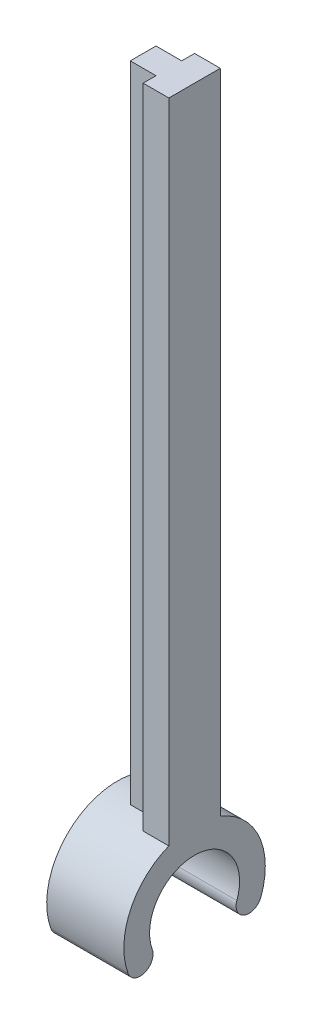
ISO-10303-21;
HEADER;
FILE_DESCRIPTION(('STEP AP214'),'2;1');
FILE_NAME('part.step','',(''),(''),'','','');
FILE_SCHEMA(('AUTOMOTIVE_DESIGN { 1 0 10303 214 1 1 1 1 }'));
ENDSEC;
DATA;
#1=APPLICATION_CONTEXT('core data for automotive mechanical design processes');
#2=APPLICATION_PROTOCOL_DEFINITION('international standard','automotive_design',2000,#1);
#3=PRODUCT_CONTEXT('',#1,'mechanical');
#4=PRODUCT('Part','Part','',(#3));
#5=PRODUCT_RELATED_PRODUCT_CATEGORY('part','',(#4));
#6=PRODUCT_DEFINITION_FORMATION('','',#4);
#7=PRODUCT_DEFINITION_CONTEXT('part definition',#1,'design');
#8=PRODUCT_DEFINITION('design','',#6,#7);
#9=PRODUCT_DEFINITION_SHAPE('','',#8);
#10=(LENGTH_UNIT() NAMED_UNIT(*) SI_UNIT(.MILLI.,.METRE.));
#11=(NAMED_UNIT(*) PLANE_ANGLE_UNIT() SI_UNIT($,.RADIAN.));
#12=(NAMED_UNIT(*) SI_UNIT($,.STERADIAN.) SOLID_ANGLE_UNIT());
#13=UNCERTAINTY_MEASURE_WITH_UNIT(LENGTH_MEASURE(1.E-05),#10,'distance_accuracy_value','');
#14=(GEOMETRIC_REPRESENTATION_CONTEXT(3) GLOBAL_UNCERTAINTY_ASSIGNED_CONTEXT((#13)) GLOBAL_UNIT_ASSIGNED_CONTEXT((#10,
#11,#12)) REPRESENTATION_CONTEXT('',''));
#15=CARTESIAN_POINT('',(0.,0.,0.));
#16=DIRECTION('',(0.,0.,1.));
#17=DIRECTION('',(1.,0.,0.));
#18=AXIS2_PLACEMENT_3D('',#15,#16,#17);
#19=CARTESIAN_POINT('',(2.,0.,0.));
#20=DIRECTION('',(-1.,0.,0.));
#21=DIRECTION('',(0.,0.,1.));
#22=AXIS2_PLACEMENT_3D('',#19,#20,#21);
#23=CYLINDRICAL_SURFACE('',#22,5.5);
#24=DIRECTION('',(-1.,0.,0.));
#25=VECTOR('',#24,1.);
#26=CARTESIAN_POINT('',(2.,5.40832691319598,-1.00000000000001));
#27=LINE('',#26,#25);
#28=CARTESIAN_POINT('',(0.,5.40832691319598,-1.00000000000001));
#29=VERTEX_POINT('',#28);
#30=CARTESIAN_POINT('',(-2.,5.40832691319598,-1.00000000000001));
#31=VERTEX_POINT('',#30);
#32=EDGE_CURVE('E155',#29,#31,#27,.T.);
#33=ORIENTED_EDGE('',*,*,#32,.F.);
#34=CARTESIAN_POINT('',(0.,0.,0.));
#35=DIRECTION('',(1.,0.,0.));
#36=DIRECTION('',(0.,0.,-1.));
#37=AXIS2_PLACEMENT_3D('',#34,#35,#36);
#38=CIRCLE('',#37,5.5);
#39=CARTESIAN_POINT('',(0.,5.1234753829798,-2.));
#40=VERTEX_POINT('',#39);
#41=EDGE_CURVE('E11',#40,#29,#38,.T.);
#42=ORIENTED_EDGE('',*,*,#41,.F.);
#43=DIRECTION('',(-1.,0.,0.));
#44=VECTOR('',#43,1.);
#45=CARTESIAN_POINT('',(2.,5.1234753829798,-2.));
#46=LINE('',#45,#44);
#47=CARTESIAN_POINT('',(2.,5.1234753829798,-2.));
#48=VERTEX_POINT('',#47);
#49=EDGE_CURVE('E206',#48,#40,#46,.T.);
#50=ORIENTED_EDGE('',*,*,#49,.F.);
#51=CARTESIAN_POINT('',(2.,0.,0.));
#52=DIRECTION('',(1.,0.,0.));
#53=DIRECTION('',(0.,0.,-1.));
#54=AXIS2_PLACEMENT_3D('',#51,#52,#53);
#55=CIRCLE('',#54,5.5);
#56=CARTESIAN_POINT('',(2.,-1.88111078829118,-5.16830941432249));
#57=VERTEX_POINT('',#56);
#58=EDGE_CURVE('E234',#57,#48,#55,.T.);
#59=ORIENTED_EDGE('',*,*,#58,.F.);
#60=DIRECTION('',(-1.,0.,0.));
#61=VECTOR('',#60,1.);
#62=CARTESIAN_POINT('',(2.,-1.88111078829118,-5.16830941432249));
#63=LINE('',#62,#61);
#64=CARTESIAN_POINT('',(-4.,-1.88111078829118,-5.16830941432249));
#65=VERTEX_POINT('',#64);
#66=EDGE_CURVE('E248',#57,#65,#63,.T.);
#67=ORIENTED_EDGE('',*,*,#66,.T.);
#68=CARTESIAN_POINT('',(-4.,0.,0.));
#69=DIRECTION('',(1.,0.,0.));
#70=DIRECTION('',(0.,0.,-1.));
#71=AXIS2_PLACEMENT_3D('',#68,#69,#70);
#72=CIRCLE('',#71,5.5);
#73=CARTESIAN_POINT('',(-4.,-1.88111078829118,5.16830941432249));
#74=VERTEX_POINT('',#73);
#75=EDGE_CURVE('E218',#65,#74,#72,.T.);
#76=ORIENTED_EDGE('',*,*,#75,.T.);
#77=DIRECTION('',(-1.,0.,0.));
#78=VECTOR('',#77,1.);
#79=CARTESIAN_POINT('',(2.,-1.88111078829118,5.16830941432249));
#80=LINE('',#79,#78);
#81=CARTESIAN_POINT('',(2.,-1.88111078829118,5.16830941432249));
#82=VERTEX_POINT('',#81);
#83=EDGE_CURVE('E245',#82,#74,#80,.T.);
#84=ORIENTED_EDGE('',*,*,#83,.F.);
#85=CARTESIAN_POINT('',(2.,5.1234753829798,2.));
#86=VERTEX_POINT('',#85);
#87=EDGE_CURVE('E233',#86,#82,#55,.T.);
#88=ORIENTED_EDGE('',*,*,#87,.F.);
#89=DIRECTION('',(-1.,0.,0.));
#90=VECTOR('',#89,1.);
#91=CARTESIAN_POINT('',(2.,5.1234753829798,2.));
#92=LINE('',#91,#90);
#93=CARTESIAN_POINT('',(0.,5.1234753829798,2.));
#94=VERTEX_POINT('',#93);
#95=EDGE_CURVE('E202',#86,#94,#92,.T.);
#96=ORIENTED_EDGE('',*,*,#95,.T.);
#97=CARTESIAN_POINT('',(0.,5.40832691319598,0.999999999999994));
#98=VERTEX_POINT('',#97);
#99=EDGE_CURVE('E50',#98,#94,#38,.T.);
#100=ORIENTED_EDGE('',*,*,#99,.F.);
#101=DIRECTION('',(-1.,0.,0.));
#102=VECTOR('',#101,1.);
#103=CARTESIAN_POINT('',(2.,5.40832691319598,0.999999999999994));
#104=LINE('',#103,#102);
#105=CARTESIAN_POINT('',(-2.,5.40832691319598,0.999999999999994));
#106=VERTEX_POINT('',#105);
#107=EDGE_CURVE('E57',#98,#106,#104,.T.);
#108=ORIENTED_EDGE('',*,*,#107,.T.);
#109=CARTESIAN_POINT('',(-2.,0.,0.));
#110=DIRECTION('',(1.,0.,0.));
#111=DIRECTION('',(0.,0.,-1.));
#112=AXIS2_PLACEMENT_3D('',#109,#110,#111);
#113=CIRCLE('',#112,5.5);
#114=EDGE_CURVE('E61',#31,#106,#113,.T.);
#115=ORIENTED_EDGE('',*,*,#114,.F.);
#116=EDGE_LOOP('',(#33,#42,#50,#59,#67,#76,#84,#88,#96,#100,#108,#115));
#117=FACE_BOUND('',#116,.T.);
#118=ADVANCED_FACE('F41',(#117),#23,.T.);
#119=CARTESIAN_POINT('',(0.,0.,0.));
#120=DIRECTION('',(1.,0.,0.));
#121=DIRECTION('',(0.,0.,-1.));
#122=AXIS2_PLACEMENT_3D('',#119,#120,#121);
#123=PLANE('',#122);
#124=DIRECTION('',(0.,-1.,0.));
#125=VECTOR('',#124,1.);
#126=CARTESIAN_POINT('',(0.,0.,-1.00000000000001));
#127=LINE('',#126,#125);
#128=CARTESIAN_POINT('',(0.,55.5,-1.));
#129=VERTEX_POINT('',#128);
#130=EDGE_CURVE('E160',#129,#29,#127,.T.);
#131=ORIENTED_EDGE('',*,*,#130,.F.);
#132=DIRECTION('',(0.,0.,-1.));
#133=VECTOR('',#132,1.);
#134=CARTESIAN_POINT('',(0.,55.5,0.));
#135=LINE('',#134,#133);
#136=CARTESIAN_POINT('',(0.,55.5,-2.));
#137=VERTEX_POINT('',#136);
#138=EDGE_CURVE('E147',#129,#137,#135,.T.);
#139=ORIENTED_EDGE('',*,*,#138,.T.);
#140=DIRECTION('',(0.,1.,0.));
#141=VECTOR('',#140,1.);
#142=CARTESIAN_POINT('',(0.,0.,-2.));
#143=LINE('',#142,#141);
#144=EDGE_CURVE('E175',#40,#137,#143,.T.);
#145=ORIENTED_EDGE('',*,*,#144,.F.);
#146=ORIENTED_EDGE('',*,*,#41,.T.);
#147=EDGE_LOOP('',(#131,#139,#145,#146));
#148=FACE_BOUND('',#147,.T.);
#149=ADVANCED_FACE('F277',(#148),#123,.F.);
#150=CARTESIAN_POINT('',(2.,0.,0.));
#151=DIRECTION('',(-1.,0.,0.));
#152=DIRECTION('',(0.,0.,1.));
#153=AXIS2_PLACEMENT_3D('',#150,#151,#152);
#154=CYLINDRICAL_SURFACE('',#153,3.5);
#155=DIRECTION('',(-1.,0.,0.));
#156=VECTOR('',#155,1.);
#157=CARTESIAN_POINT('',(2.,-1.19707050163984,3.28892417275068));
#158=LINE('',#157,#156);
#159=CARTESIAN_POINT('',(2.,-1.19707050163984,3.28892417275068));
#160=VERTEX_POINT('',#159);
#161=CARTESIAN_POINT('',(-4.,-1.19707050163984,3.28892417275068));
#162=VERTEX_POINT('',#161);
#163=EDGE_CURVE('E242',#160,#162,#158,.T.);
#164=ORIENTED_EDGE('',*,*,#163,.T.);
#165=CARTESIAN_POINT('',(-4.,0.,0.));
#166=DIRECTION('',(1.,0.,0.));
#167=DIRECTION('',(0.,0.,-1.));
#168=AXIS2_PLACEMENT_3D('',#165,#166,#167);
#169=CIRCLE('',#168,3.5);
#170=CARTESIAN_POINT('',(-4.,-1.19707050163984,-3.28892417275068));
#171=VERTEX_POINT('',#170);
#172=EDGE_CURVE('E210',#171,#162,#169,.T.);
#173=ORIENTED_EDGE('',*,*,#172,.F.);
#174=DIRECTION('',(-1.,0.,0.));
#175=VECTOR('',#174,1.);
#176=CARTESIAN_POINT('',(2.,-1.19707050163984,-3.28892417275068));
#177=LINE('',#176,#175);
#178=CARTESIAN_POINT('',(2.,-1.19707050163984,-3.28892417275068));
#179=VERTEX_POINT('',#178);
#180=EDGE_CURVE('E250',#179,#171,#177,.T.);
#181=ORIENTED_EDGE('',*,*,#180,.F.);
#182=CARTESIAN_POINT('',(2.,0.,0.));
#183=DIRECTION('',(1.,0.,0.));
#184=DIRECTION('',(0.,0.,-1.));
#185=AXIS2_PLACEMENT_3D('',#182,#183,#184);
#186=CIRCLE('',#185,3.5);
#187=EDGE_CURVE('E226',#179,#160,#186,.T.);
#188=ORIENTED_EDGE('',*,*,#187,.T.);
#189=EDGE_LOOP('',(#164,#173,#181,#188));
#190=FACE_BOUND('',#189,.T.);
#191=ADVANCED_FACE('F43',(#190),#154,.F.);
#192=CARTESIAN_POINT('',(2.,-1.53909064496551,-4.22861679353659));
#193=DIRECTION('',(-1.,0.,0.));
#194=DIRECTION('',(0.,0.,1.));
#195=AXIS2_PLACEMENT_3D('',#192,#193,#194);
#196=CYLINDRICAL_SURFACE('',#195,1.);
#197=ORIENTED_EDGE('',*,*,#180,.T.);
#198=CARTESIAN_POINT('',(-4.,-1.53909064496551,-4.22861679353659));
#199=DIRECTION('',(1.,0.,0.));
#200=DIRECTION('',(0.,0.,-1.));
#201=AXIS2_PLACEMENT_3D('',#198,#199,#200);
#202=CIRCLE('',#201,1.);
#203=EDGE_CURVE('E214',#65,#171,#202,.F.);
#204=ORIENTED_EDGE('',*,*,#203,.F.);
#205=ORIENTED_EDGE('',*,*,#66,.F.);
#206=CARTESIAN_POINT('',(2.,-1.53909064496551,-4.22861679353659));
#207=DIRECTION('',(1.,0.,0.));
#208=DIRECTION('',(0.,0.,-1.));
#209=AXIS2_PLACEMENT_3D('',#206,#207,#208);
#210=CIRCLE('',#209,1.);
#211=EDGE_CURVE('E229',#57,#179,#210,.F.);
#212=ORIENTED_EDGE('',*,*,#211,.T.);
#213=EDGE_LOOP('',(#197,#204,#205,#212));
#214=FACE_BOUND('',#213,.T.);
#215=ADVANCED_FACE('F287',(#214),#196,.T.);
#216=CARTESIAN_POINT('',(2.,-1.53909064496551,4.22861679353659));
#217=DIRECTION('',(-1.,0.,0.));
#218=DIRECTION('',(0.,0.,1.));
#219=AXIS2_PLACEMENT_3D('',#216,#217,#218);
#220=CYLINDRICAL_SURFACE('',#219,1.);
#221=ORIENTED_EDGE('',*,*,#83,.T.);
#222=CARTESIAN_POINT('',(-4.,-1.53909064496551,4.22861679353659));
#223=DIRECTION('',(1.,0.,0.));
#224=DIRECTION('',(0.,0.,-1.));
#225=AXIS2_PLACEMENT_3D('',#222,#223,#224);
#226=CIRCLE('',#225,1.);
#227=EDGE_CURVE('E222',#74,#162,#226,.T.);
#228=ORIENTED_EDGE('',*,*,#227,.T.);
#229=ORIENTED_EDGE('',*,*,#163,.F.);
#230=CARTESIAN_POINT('',(2.,-1.53909064496551,4.22861679353659));
#231=DIRECTION('',(1.,0.,0.));
#232=DIRECTION('',(0.,0.,-1.));
#233=AXIS2_PLACEMENT_3D('',#230,#231,#232);
#234=CIRCLE('',#233,1.);
#235=EDGE_CURVE('E238',#82,#160,#234,.T.);
#236=ORIENTED_EDGE('',*,*,#235,.F.);
#237=EDGE_LOOP('',(#221,#228,#229,#236));
#238=FACE_BOUND('',#237,.T.);
#239=ADVANCED_FACE('F285',(#238),#220,.T.);
#240=CARTESIAN_POINT('',(2.,0.,0.));
#241=DIRECTION('',(1.,0.,0.));
#242=DIRECTION('',(0.,0.,-1.));
#243=AXIS2_PLACEMENT_3D('',#240,#241,#242);
#244=PLANE('',#243);
#245=ORIENTED_EDGE('',*,*,#235,.T.);
#246=ORIENTED_EDGE('',*,*,#187,.F.);
#247=ORIENTED_EDGE('',*,*,#211,.F.);
#248=ORIENTED_EDGE('',*,*,#58,.T.);
#249=DIRECTION('',(0.,1.,0.));
#250=VECTOR('',#249,1.);
#251=CARTESIAN_POINT('',(2.,0.,-2.));
#252=LINE('',#251,#250);
#253=CARTESIAN_POINT('',(2.,55.5,-2.));
#254=VERTEX_POINT('',#253);
#255=EDGE_CURVE('E176',#48,#254,#252,.T.);
#256=ORIENTED_EDGE('',*,*,#255,.T.);
#257=DIRECTION('',(0.,0.,-1.));
#258=VECTOR('',#257,1.);
#259=CARTESIAN_POINT('',(2.,55.5,0.));
#260=LINE('',#259,#258);
#261=CARTESIAN_POINT('',(2.,55.5,2.));
#262=VERTEX_POINT('',#261);
#263=EDGE_CURVE('E179',#262,#254,#260,.T.);
#264=ORIENTED_EDGE('',*,*,#263,.F.);
#265=DIRECTION('',(0.,1.,0.));
#266=VECTOR('',#265,1.);
#267=CARTESIAN_POINT('',(2.,0.,2.));
#268=LINE('',#267,#266);
#269=EDGE_CURVE('E184',#86,#262,#268,.T.);
#270=ORIENTED_EDGE('',*,*,#269,.F.);
#271=ORIENTED_EDGE('',*,*,#87,.T.);
#272=EDGE_LOOP('',(#245,#246,#247,#248,#256,#264,#270,#271));
#273=FACE_BOUND('',#272,.T.);
#274=ADVANCED_FACE('F293',(#273),#244,.T.);
#275=CARTESIAN_POINT('',(-4.,0.,0.));
#276=DIRECTION('',(1.,0.,0.));
#277=DIRECTION('',(0.,0.,-1.));
#278=AXIS2_PLACEMENT_3D('',#275,#276,#277);
#279=PLANE('',#278);
#280=ORIENTED_EDGE('',*,*,#172,.T.);
#281=ORIENTED_EDGE('',*,*,#227,.F.);
#282=ORIENTED_EDGE('',*,*,#75,.F.);
#283=ORIENTED_EDGE('',*,*,#203,.T.);
#284=EDGE_LOOP('',(#280,#281,#282,#283));
#285=FACE_BOUND('',#284,.T.);
#286=ADVANCED_FACE('F304',(#285),#279,.F.);
#287=CARTESIAN_POINT('',(2.,0.,-2.));
#288=DIRECTION('',(0.,0.,1.));
#289=DIRECTION('',(1.,0.,0.));
#290=AXIS2_PLACEMENT_3D('',#287,#288,#289);
#291=PLANE('',#290);
#292=ORIENTED_EDGE('',*,*,#255,.F.);
#293=ORIENTED_EDGE('',*,*,#49,.T.);
#294=ORIENTED_EDGE('',*,*,#144,.T.);
#295=DIRECTION('',(-1.,0.,0.));
#296=VECTOR('',#295,1.);
#297=CARTESIAN_POINT('',(2.,55.5,-2.));
#298=LINE('',#297,#296);
#299=EDGE_CURVE('E199',#254,#137,#298,.T.);
#300=ORIENTED_EDGE('',*,*,#299,.F.);
#301=EDGE_LOOP('',(#292,#293,#294,#300));
#302=FACE_BOUND('',#301,.T.);
#303=ADVANCED_FACE('F315',(#302),#291,.F.);
#304=CARTESIAN_POINT('',(2.,0.,2.));
#305=DIRECTION('',(0.,0.,1.));
#306=DIRECTION('',(0.,-1.,0.));
#307=AXIS2_PLACEMENT_3D('',#304,#305,#306);
#308=PLANE('',#307);
#309=ORIENTED_EDGE('',*,*,#95,.F.);
#310=ORIENTED_EDGE('',*,*,#269,.T.);
#311=DIRECTION('',(-1.,0.,0.));
#312=VECTOR('',#311,1.);
#313=CARTESIAN_POINT('',(2.,55.5,2.));
#314=LINE('',#313,#312);
#315=CARTESIAN_POINT('',(0.,55.5,2.));
#316=VERTEX_POINT('',#315);
#317=EDGE_CURVE('E187',#262,#316,#314,.T.);
#318=ORIENTED_EDGE('',*,*,#317,.T.);
#319=DIRECTION('',(0.,1.,0.));
#320=VECTOR('',#319,1.);
#321=CARTESIAN_POINT('',(0.,0.,2.));
#322=LINE('',#321,#320);
#323=EDGE_CURVE('E180',#94,#316,#322,.T.);
#324=ORIENTED_EDGE('',*,*,#323,.F.);
#325=EDGE_LOOP('',(#309,#310,#318,#324));
#326=FACE_BOUND('',#325,.T.);
#327=ADVANCED_FACE('F263',(#326),#308,.T.);
#328=CARTESIAN_POINT('',(2.,55.5,0.));
#329=DIRECTION('',(0.,1.,0.));
#330=DIRECTION('',(0.,0.,1.));
#331=AXIS2_PLACEMENT_3D('',#328,#329,#330);
#332=PLANE('',#331);
#333=CARTESIAN_POINT('',(0.,55.5,1.));
#334=VERTEX_POINT('',#333);
#335=EDGE_CURVE('E191',#316,#334,#135,.T.);
#336=ORIENTED_EDGE('',*,*,#335,.F.);
#337=ORIENTED_EDGE('',*,*,#317,.F.);
#338=ORIENTED_EDGE('',*,*,#263,.T.);
#339=ORIENTED_EDGE('',*,*,#299,.T.);
#340=ORIENTED_EDGE('',*,*,#138,.F.);
#341=DIRECTION('',(1.,0.,0.));
#342=VECTOR('',#341,1.);
#343=CARTESIAN_POINT('',(-2.,55.5,-1.));
#344=LINE('',#343,#342);
#345=CARTESIAN_POINT('',(-2.,55.5,-1.));
#346=VERTEX_POINT('',#345);
#347=EDGE_CURVE('E143',#346,#129,#344,.T.);
#348=ORIENTED_EDGE('',*,*,#347,.F.);
#349=DIRECTION('',(0.,0.,-1.));
#350=VECTOR('',#349,1.);
#351=CARTESIAN_POINT('',(-2.,55.5,0.));
#352=LINE('',#351,#350);
#353=CARTESIAN_POINT('',(-2.,55.5,1.));
#354=VERTEX_POINT('',#353);
#355=EDGE_CURVE('E131',#354,#346,#352,.T.);
#356=ORIENTED_EDGE('',*,*,#355,.F.);
#357=DIRECTION('',(1.,0.,0.));
#358=VECTOR('',#357,1.);
#359=CARTESIAN_POINT('',(-2.,55.5,1.));
#360=LINE('',#359,#358);
#361=EDGE_CURVE('E152',#354,#334,#360,.T.);
#362=ORIENTED_EDGE('',*,*,#361,.T.);
#363=EDGE_LOOP('',(#336,#337,#338,#339,#340,#348,#356,#362));
#364=FACE_BOUND('',#363,.T.);
#365=ADVANCED_FACE('F145',(#364),#332,.T.);
#366=ORIENTED_EDGE('',*,*,#335,.T.);
#367=DIRECTION('',(0.,-1.,0.));
#368=VECTOR('',#367,1.);
#369=CARTESIAN_POINT('',(0.,0.,0.999999999999993));
#370=LINE('',#369,#368);
#371=EDGE_CURVE('E157',#334,#98,#370,.T.);
#372=ORIENTED_EDGE('',*,*,#371,.T.);
#373=ORIENTED_EDGE('',*,*,#99,.T.);
#374=ORIENTED_EDGE('',*,*,#323,.T.);
#375=EDGE_LOOP('',(#366,#372,#373,#374));
#376=FACE_BOUND('',#375,.T.);
#377=ADVANCED_FACE('F256',(#376),#123,.F.);
#378=CARTESIAN_POINT('',(-2.,0.,-1.00000000000001));
#379=DIRECTION('',(0.,0.,1.));
#380=DIRECTION('',(0.,-1.,0.));
#381=AXIS2_PLACEMENT_3D('',#378,#379,#380);
#382=PLANE('',#381);
#383=ORIENTED_EDGE('',*,*,#130,.T.);
#384=ORIENTED_EDGE('',*,*,#32,.T.);
#385=DIRECTION('',(0.,-1.,0.));
#386=VECTOR('',#385,1.);
#387=CARTESIAN_POINT('',(-2.,0.,-1.00000000000001));
#388=LINE('',#387,#386);
#389=EDGE_CURVE('E135',#346,#31,#388,.T.);
#390=ORIENTED_EDGE('',*,*,#389,.F.);
#391=ORIENTED_EDGE('',*,*,#347,.T.);
#392=EDGE_LOOP('',(#383,#384,#390,#391));
#393=FACE_BOUND('',#392,.T.);
#394=ADVANCED_FACE('F154',(#393),#382,.F.);
#395=CARTESIAN_POINT('',(-2.,0.,0.999999999999993));
#396=DIRECTION('',(0.,0.,1.));
#397=DIRECTION('',(0.,-1.,0.));
#398=AXIS2_PLACEMENT_3D('',#395,#396,#397);
#399=PLANE('',#398);
#400=ORIENTED_EDGE('',*,*,#107,.F.);
#401=ORIENTED_EDGE('',*,*,#371,.F.);
#402=ORIENTED_EDGE('',*,*,#361,.F.);
#403=DIRECTION('',(0.,-1.,0.));
#404=VECTOR('',#403,1.);
#405=CARTESIAN_POINT('',(-2.,0.,0.999999999999993));
#406=LINE('',#405,#404);
#407=EDGE_CURVE('E137',#354,#106,#406,.T.);
#408=ORIENTED_EDGE('',*,*,#407,.T.);
#409=EDGE_LOOP('',(#400,#401,#402,#408));
#410=FACE_BOUND('',#409,.T.);
#411=ADVANCED_FACE('F267',(#410),#399,.T.);
#412=CARTESIAN_POINT('',(-2.,0.,0.));
#413=DIRECTION('',(1.,0.,0.));
#414=DIRECTION('',(0.,0.,-1.));
#415=AXIS2_PLACEMENT_3D('',#412,#413,#414);
#416=PLANE('',#415);
#417=ORIENTED_EDGE('',*,*,#389,.T.);
#418=ORIENTED_EDGE('',*,*,#114,.T.);
#419=ORIENTED_EDGE('',*,*,#407,.F.);
#420=ORIENTED_EDGE('',*,*,#355,.T.);
#421=EDGE_LOOP('',(#417,#418,#419,#420));
#422=FACE_BOUND('',#421,.T.);
#423=ADVANCED_FACE('F133',(#422),#416,.F.);
#424=CLOSED_SHELL('',(#118,#149,#191,#215,#239,#274,#286,#303,#327,#365,#377,#394,#411,#423));
#425=MANIFOLD_SOLID_BREP('B2',#424);
#426=ADVANCED_BREP_SHAPE_REPRESENTATION('',(#18,#425),#14);
#427=SHAPE_DEFINITION_REPRESENTATION(#9,#426);
ENDSEC;
END-ISO-10303-21;
